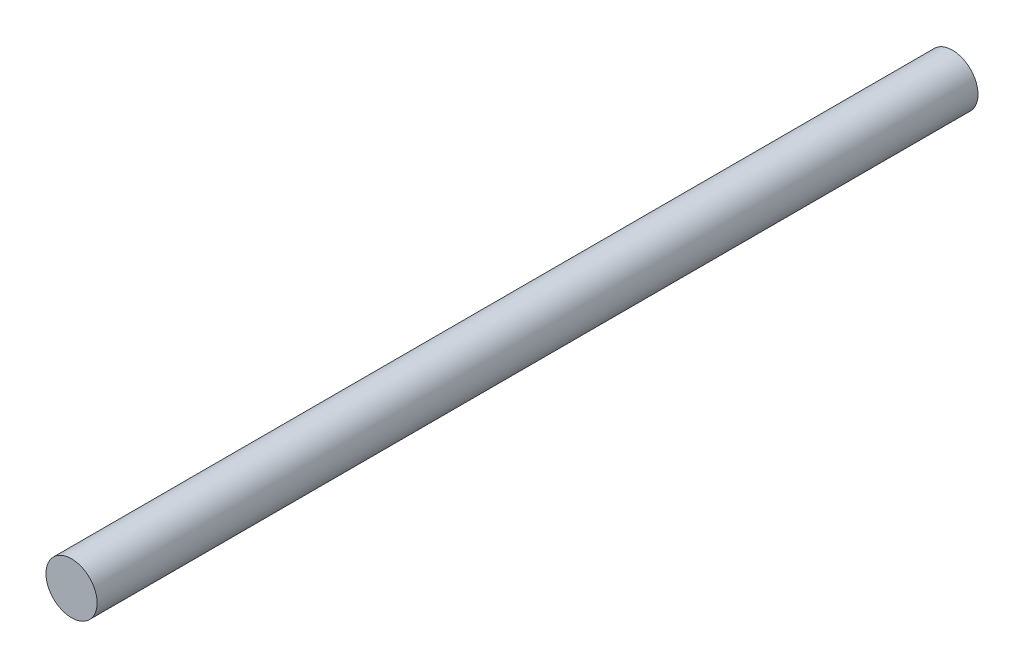
ISO-10303-21;
HEADER;
FILE_DESCRIPTION(('STEP AP214'),'2;1');
FILE_NAME('part.step','',(''),(''),'','','');
FILE_SCHEMA(('AUTOMOTIVE_DESIGN { 1 0 10303 214 1 1 1 1 }'));
ENDSEC;
DATA;
#1=APPLICATION_CONTEXT('core data for automotive mechanical design processes');
#2=APPLICATION_PROTOCOL_DEFINITION('international standard','automotive_design',2000,#1);
#3=PRODUCT_CONTEXT('',#1,'mechanical');
#4=PRODUCT('Part','Part','',(#3));
#5=PRODUCT_RELATED_PRODUCT_CATEGORY('part','',(#4));
#6=PRODUCT_DEFINITION_FORMATION('','',#4);
#7=PRODUCT_DEFINITION_CONTEXT('part definition',#1,'design');
#8=PRODUCT_DEFINITION('design','',#6,#7);
#9=PRODUCT_DEFINITION_SHAPE('','',#8);
#10=(LENGTH_UNIT() NAMED_UNIT(*) SI_UNIT(.MILLI.,.METRE.));
#11=(NAMED_UNIT(*) PLANE_ANGLE_UNIT() SI_UNIT($,.RADIAN.));
#12=(NAMED_UNIT(*) SI_UNIT($,.STERADIAN.) SOLID_ANGLE_UNIT());
#13=UNCERTAINTY_MEASURE_WITH_UNIT(LENGTH_MEASURE(1.E-05),#10,'distance_accuracy_value','');
#14=(GEOMETRIC_REPRESENTATION_CONTEXT(3) GLOBAL_UNCERTAINTY_ASSIGNED_CONTEXT((#13)) GLOBAL_UNIT_ASSIGNED_CONTEXT((#10,
#11,#12)) REPRESENTATION_CONTEXT('',''));
#15=CARTESIAN_POINT('',(0.,0.,0.));
#16=DIRECTION('',(0.,0.,1.));
#17=DIRECTION('',(1.,0.,0.));
#18=AXIS2_PLACEMENT_3D('',#15,#16,#17);
#19=CARTESIAN_POINT('',(0.,0.,-93.));
#20=DIRECTION('',(0.,0.,1.));
#21=DIRECTION('',(1.,0.,0.));
#22=AXIS2_PLACEMENT_3D('',#19,#20,#21);
#23=CYLINDRICAL_SURFACE('',#22,2.7);
#24=CARTESIAN_POINT('',(0.,0.,-93.));
#25=DIRECTION('',(0.,0.,1.));
#26=DIRECTION('',(1.,0.,0.));
#27=AXIS2_PLACEMENT_3D('',#24,#25,#26);
#28=CIRCLE('',#27,2.7);
#29=CARTESIAN_POINT('',(2.7,0.,-93.));
#30=VERTEX_POINT('',#29);
#31=EDGE_CURVE('E10',#30,#30,#28,.T.);
#32=CARTESIAN_POINT('',(0.,0.,0.));
#33=DIRECTION('',(0.,0.,1.));
#34=DIRECTION('',(1.,0.,0.));
#35=AXIS2_PLACEMENT_3D('',#32,#33,#34);
#36=CIRCLE('',#35,2.7);
#37=CARTESIAN_POINT('',(2.7,0.,0.));
#38=VERTEX_POINT('',#37);
#39=EDGE_CURVE('E35',#38,#38,#36,.T.);
#40=CARTESIAN_POINT('',(2.7,0.,-93.));
#41=CARTESIAN_POINT('',(2.7,0.,-92.03125));
#42=CARTESIAN_POINT('',(2.7,0.,-91.0625));
#43=CARTESIAN_POINT('',(2.7,0.,-89.125));
#44=CARTESIAN_POINT('',(2.7,0.,-88.15625));
#45=CARTESIAN_POINT('',(2.7,0.,-86.21875));
#46=CARTESIAN_POINT('',(2.7,0.,-85.25));
#47=CARTESIAN_POINT('',(2.7,0.,-83.3125));
#48=CARTESIAN_POINT('',(2.7,0.,-82.34375));
#49=CARTESIAN_POINT('',(2.7,0.,-80.40625));
#50=CARTESIAN_POINT('',(2.7,0.,-79.4375));
#51=CARTESIAN_POINT('',(2.7,0.,-77.5));
#52=CARTESIAN_POINT('',(2.7,0.,-76.53125));
#53=CARTESIAN_POINT('',(2.7,0.,-74.59375));
#54=CARTESIAN_POINT('',(2.7,0.,-73.625));
#55=CARTESIAN_POINT('',(2.7,0.,-71.6875));
#56=CARTESIAN_POINT('',(2.7,0.,-70.71875));
#57=CARTESIAN_POINT('',(2.7,0.,-68.78125));
#58=CARTESIAN_POINT('',(2.7,0.,-67.8125));
#59=CARTESIAN_POINT('',(2.7,0.,-65.875));
#60=CARTESIAN_POINT('',(2.7,0.,-64.90625));
#61=CARTESIAN_POINT('',(2.7,0.,-62.96875));
#62=CARTESIAN_POINT('',(2.7,0.,-62.));
#63=CARTESIAN_POINT('',(2.7,0.,-60.0625));
#64=CARTESIAN_POINT('',(2.7,0.,-59.09375));
#65=CARTESIAN_POINT('',(2.7,0.,-57.15625));
#66=CARTESIAN_POINT('',(2.7,0.,-56.1875));
#67=CARTESIAN_POINT('',(2.7,0.,-54.25));
#68=CARTESIAN_POINT('',(2.7,0.,-53.28125));
#69=CARTESIAN_POINT('',(2.7,0.,-51.34375));
#70=CARTESIAN_POINT('',(2.7,0.,-50.375));
#71=CARTESIAN_POINT('',(2.7,0.,-48.4375));
#72=CARTESIAN_POINT('',(2.7,0.,-47.46875));
#73=CARTESIAN_POINT('',(2.7,0.,-45.53125));
#74=CARTESIAN_POINT('',(2.7,0.,-44.5625));
#75=CARTESIAN_POINT('',(2.7,0.,-42.625));
#76=CARTESIAN_POINT('',(2.7,0.,-41.65625));
#77=CARTESIAN_POINT('',(2.7,0.,-39.71875));
#78=CARTESIAN_POINT('',(2.7,0.,-38.75));
#79=CARTESIAN_POINT('',(2.7,0.,-36.8125));
#80=CARTESIAN_POINT('',(2.7,0.,-35.84375));
#81=CARTESIAN_POINT('',(2.7,0.,-33.90625));
#82=CARTESIAN_POINT('',(2.7,0.,-32.9375));
#83=CARTESIAN_POINT('',(2.7,0.,-31.));
#84=CARTESIAN_POINT('',(2.7,0.,-30.03125));
#85=CARTESIAN_POINT('',(2.7,0.,-28.09375));
#86=CARTESIAN_POINT('',(2.7,0.,-27.125));
#87=CARTESIAN_POINT('',(2.7,0.,-25.1875));
#88=CARTESIAN_POINT('',(2.7,0.,-24.21875));
#89=CARTESIAN_POINT('',(2.7,0.,-22.28125));
#90=CARTESIAN_POINT('',(2.7,0.,-21.3125));
#91=CARTESIAN_POINT('',(2.7,0.,-19.375));
#92=CARTESIAN_POINT('',(2.7,0.,-18.40625));
#93=CARTESIAN_POINT('',(2.7,0.,-16.46875));
#94=CARTESIAN_POINT('',(2.7,0.,-15.5));
#95=CARTESIAN_POINT('',(2.7,0.,-13.5625));
#96=CARTESIAN_POINT('',(2.7,0.,-12.59375));
#97=CARTESIAN_POINT('',(2.7,0.,-10.65625));
#98=CARTESIAN_POINT('',(2.7,0.,-9.68750000000001));
#99=CARTESIAN_POINT('',(2.7,0.,-7.75000000000001));
#100=CARTESIAN_POINT('',(2.7,0.,-6.78125000000001));
#101=CARTESIAN_POINT('',(2.7,0.,-4.84375000000001));
#102=CARTESIAN_POINT('',(2.7,0.,-3.87500000000001));
#103=CARTESIAN_POINT('',(2.7,0.,-1.93750000000001));
#104=CARTESIAN_POINT('',(2.7,0.,-0.968750000000013));
#105=CARTESIAN_POINT('',(2.7,0.,0.));
#106=B_SPLINE_CURVE_WITH_KNOTS('',3,(#40,#41,#42,#43,#44,#45,#46,#47,#48,#49,#50,#51,#52,#53,
#54,#55,#56,#57,#58,#59,#60,#61,#62,#63,#64,#65,#66,#67,#68,#69,#70,#71,#72,#73,#74,#75,#76,#77,
#78,#79,#80,#81,#82,#83,#84,#85,#86,#87,#88,#89,#90,#91,#92,#93,#94,#95,#96,#97,#98,#99,#100,
#101,#102,#103,#104,#105),.UNSPECIFIED.,.F.,.F.,(4,2,2,2,2,2,2,2,2,2,2,2,2,2,2,2,2,2,2,2,2,2,2,
2,2,2,2,2,2,2,2,2,4),(0.,2.90625,5.8125,8.71875,11.625,14.53125,17.4375,20.34375,23.25,26.15625,
29.0625,31.96875,34.875,37.78125,40.6875,43.59375,46.5,49.40625,52.3125,55.21875,58.125,
61.03125,63.9375,66.84375,69.75,72.65625,75.5625,78.46875,81.375,84.28125,87.1875,90.09375,93.),.UNSPECIFIED.);
#107=EDGE_CURVE('BSEAM32',#30,#38,#106,.T.);
#108=ORIENTED_EDGE('',*,*,#31,.T.);
#109=ORIENTED_EDGE('',*,*,#39,.F.);
#110=ORIENTED_EDGE('',*,*,#107,.T.);
#111=ORIENTED_EDGE('',*,*,#107,.F.);
#112=EDGE_LOOP('',(#108,#110,#109,#111));
#113=FACE_BOUND('',#112,.T.);
#114=ADVANCED_FACE('F32',(#113),#23,.T.);
#115=CARTESIAN_POINT('',(0.,0.,-93.));
#116=DIRECTION('',(0.,0.,1.));
#117=DIRECTION('',(1.,0.,0.));
#118=AXIS2_PLACEMENT_3D('',#115,#116,#117);
#119=PLANE('',#118);
#120=ORIENTED_EDGE('',*,*,#31,.F.);
#121=EDGE_LOOP('',(#120));
#122=FACE_BOUND('',#121,.T.);
#123=ADVANCED_FACE('F51',(#122),#119,.F.);
#124=CARTESIAN_POINT('',(0.,0.,0.));
#125=DIRECTION('',(0.,0.,1.));
#126=DIRECTION('',(1.,0.,0.));
#127=AXIS2_PLACEMENT_3D('',#124,#125,#126);
#128=PLANE('',#127);
#129=ORIENTED_EDGE('',*,*,#39,.T.);
#130=EDGE_LOOP('',(#129));
#131=FACE_BOUND('',#130,.T.);
#132=ADVANCED_FACE('F48',(#131),#128,.T.);
#133=CLOSED_SHELL('',(#114,#123,#132));
#134=MANIFOLD_SOLID_BREP('B2',#133);
#135=ADVANCED_BREP_SHAPE_REPRESENTATION('',(#18,#134),#14);
#136=SHAPE_DEFINITION_REPRESENTATION(#9,#135);
ENDSEC;
END-ISO-10303-21;
